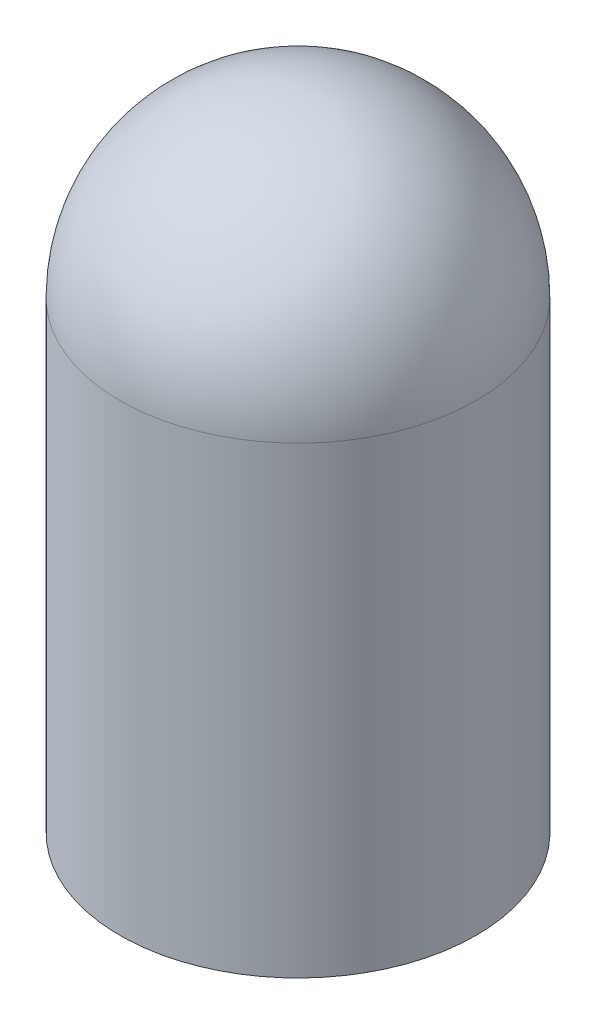
ISO-10303-21;
HEADER;
FILE_DESCRIPTION(('STEP AP214'),'2;1');
FILE_NAME('part.step','',(''),(''),'','','');
FILE_SCHEMA(('AUTOMOTIVE_DESIGN { 1 0 10303 214 1 1 1 1 }'));
ENDSEC;
DATA;
#1=APPLICATION_CONTEXT('core data for automotive mechanical design processes');
#2=APPLICATION_PROTOCOL_DEFINITION('international standard','automotive_design',2000,#1);
#3=PRODUCT_CONTEXT('',#1,'mechanical');
#4=PRODUCT('Part','Part','',(#3));
#5=PRODUCT_RELATED_PRODUCT_CATEGORY('part','',(#4));
#6=PRODUCT_DEFINITION_FORMATION('','',#4);
#7=PRODUCT_DEFINITION_CONTEXT('part definition',#1,'design');
#8=PRODUCT_DEFINITION('design','',#6,#7);
#9=PRODUCT_DEFINITION_SHAPE('','',#8);
#10=(LENGTH_UNIT() NAMED_UNIT(*) SI_UNIT(.MILLI.,.METRE.));
#11=(NAMED_UNIT(*) PLANE_ANGLE_UNIT() SI_UNIT($,.RADIAN.));
#12=(NAMED_UNIT(*) SI_UNIT($,.STERADIAN.) SOLID_ANGLE_UNIT());
#13=UNCERTAINTY_MEASURE_WITH_UNIT(LENGTH_MEASURE(1.E-05),#10,'distance_accuracy_value','');
#14=(GEOMETRIC_REPRESENTATION_CONTEXT(3) GLOBAL_UNCERTAINTY_ASSIGNED_CONTEXT((#13)) GLOBAL_UNIT_ASSIGNED_CONTEXT((#10,
#11,#12)) REPRESENTATION_CONTEXT('',''));
#15=CARTESIAN_POINT('',(0.,0.,0.));
#16=DIRECTION('',(0.,0.,1.));
#17=DIRECTION('',(1.,0.,0.));
#18=AXIS2_PLACEMENT_3D('',#15,#16,#17);
#19=CARTESIAN_POINT('',(0.,0.,0.));
#20=DIRECTION('',(0.,-1.,0.));
#21=DIRECTION('',(1.,0.,0.));
#22=AXIS2_PLACEMENT_3D('',#19,#20,#21);
#23=PLANE('',#22);
#24=CARTESIAN_POINT('',(0.,0.,0.));
#25=DIRECTION('',(0.,-1.,0.));
#26=DIRECTION('',(1.,0.,0.));
#27=AXIS2_PLACEMENT_3D('',#24,#25,#26);
#28=CIRCLE('',#27,2.5);
#29=CARTESIAN_POINT('',(2.5,0.,0.));
#30=VERTEX_POINT('',#29);
#31=EDGE_CURVE('E10',#30,#30,#28,.T.);
#32=ORIENTED_EDGE('',*,*,#31,.T.);
#33=EDGE_LOOP('',(#32));
#34=FACE_BOUND('',#33,.T.);
#35=ADVANCED_FACE('F31',(#34),#23,.T.);
#36=CARTESIAN_POINT('',(0.,0.,0.));
#37=DIRECTION('',(0.,-1.,0.));
#38=DIRECTION('',(1.,0.,0.));
#39=AXIS2_PLACEMENT_3D('',#36,#37,#38);
#40=CYLINDRICAL_SURFACE('',#39,2.5);
#41=CARTESIAN_POINT('',(0.,6.5,0.));
#42=DIRECTION('',(0.,-1.,0.));
#43=DIRECTION('',(1.,0.,0.));
#44=AXIS2_PLACEMENT_3D('',#41,#42,#43);
#45=CIRCLE('',#44,2.5);
#46=CARTESIAN_POINT('',(2.5,6.5,0.));
#47=VERTEX_POINT('',#46);
#48=EDGE_CURVE('E37',#47,#47,#45,.T.);
#49=ORIENTED_EDGE('',*,*,#48,.T.);
#50=EDGE_LOOP('',(#49));
#51=FACE_BOUND('',#50,.T.);
#52=ORIENTED_EDGE('',*,*,#31,.F.);
#53=EDGE_LOOP('',(#52));
#54=FACE_BOUND('',#53,.T.);
#55=ADVANCED_FACE('F43',(#51,#54),#40,.T.);
#56=CARTESIAN_POINT('',(0.,6.5,0.));
#57=DIRECTION('',(0.,-1.,0.));
#58=DIRECTION('',(1.,0.,0.));
#59=AXIS2_PLACEMENT_3D('',#56,#57,#58);
#60=SPHERICAL_SURFACE('',#59,2.5);
#61=ORIENTED_EDGE('',*,*,#48,.F.);
#62=EDGE_LOOP('',(#61));
#63=FACE_BOUND('',#62,.T.);
#64=ADVANCED_FACE('F46',(#63),#60,.T.);
#65=CLOSED_SHELL('',(#35,#55,#64));
#66=MANIFOLD_SOLID_BREP('B2',#65);
#67=ADVANCED_BREP_SHAPE_REPRESENTATION('',(#18,#66),#14);
#68=SHAPE_DEFINITION_REPRESENTATION(#9,#67);
ENDSEC;
END-ISO-10303-21;
